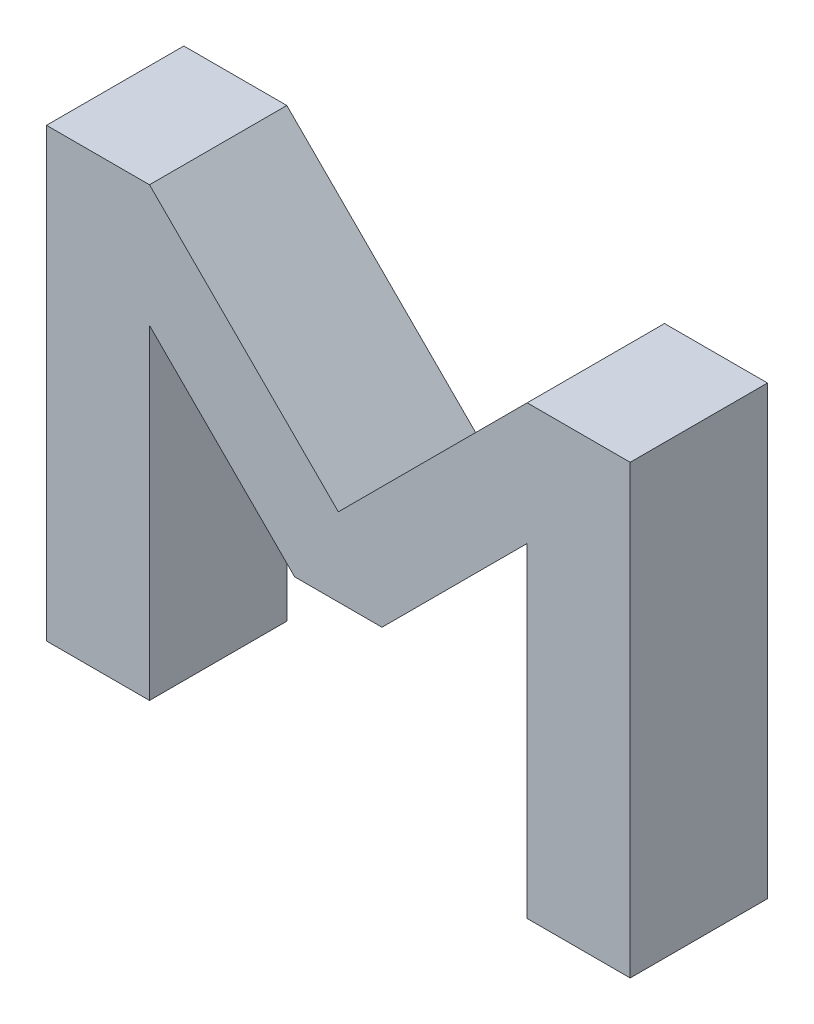
ISO-10303-21;
HEADER;
FILE_DESCRIPTION(('STEP AP214'),'2;1');
FILE_NAME('part.step','',(''),(''),'','','');
FILE_SCHEMA(('AUTOMOTIVE_DESIGN { 1 0 10303 214 1 1 1 1 }'));
ENDSEC;
DATA;
#1=APPLICATION_CONTEXT('core data for automotive mechanical design processes');
#2=APPLICATION_PROTOCOL_DEFINITION('international standard','automotive_design',2000,#1);
#3=PRODUCT_CONTEXT('',#1,'mechanical');
#4=PRODUCT('Part','Part','',(#3));
#5=PRODUCT_RELATED_PRODUCT_CATEGORY('part','',(#4));
#6=PRODUCT_DEFINITION_FORMATION('','',#4);
#7=PRODUCT_DEFINITION_CONTEXT('part definition',#1,'design');
#8=PRODUCT_DEFINITION('design','',#6,#7);
#9=PRODUCT_DEFINITION_SHAPE('','',#8);
#10=(LENGTH_UNIT() NAMED_UNIT(*) SI_UNIT(.MILLI.,.METRE.));
#11=(NAMED_UNIT(*) PLANE_ANGLE_UNIT() SI_UNIT($,.RADIAN.));
#12=(NAMED_UNIT(*) SI_UNIT($,.STERADIAN.) SOLID_ANGLE_UNIT());
#13=UNCERTAINTY_MEASURE_WITH_UNIT(LENGTH_MEASURE(1.E-05),#10,'distance_accuracy_value','');
#14=(GEOMETRIC_REPRESENTATION_CONTEXT(3) GLOBAL_UNCERTAINTY_ASSIGNED_CONTEXT((#13)) GLOBAL_UNIT_ASSIGNED_CONTEXT((#10,
#11,#12)) REPRESENTATION_CONTEXT('',''));
#15=CARTESIAN_POINT('',(0.,0.,0.));
#16=DIRECTION('',(0.,0.,1.));
#17=DIRECTION('',(1.,0.,0.));
#18=AXIS2_PLACEMENT_3D('',#15,#16,#17);
#19=CARTESIAN_POINT('',(175.078092115726,133.228481613816,20.));
#20=DIRECTION('',(0.,1.,0.));
#21=DIRECTION('',(0.,0.,1.));
#22=AXIS2_PLACEMENT_3D('',#19,#20,#21);
#23=PLANE('',#22);
#24=DIRECTION('',(1.,0.,0.));
#25=VECTOR('',#24,1.);
#26=CARTESIAN_POINT('',(175.078092115726,133.228481613816,0.));
#27=LINE('',#26,#25);
#28=CARTESIAN_POINT('',(175.078092115726,133.228481613816,0.));
#29=VERTEX_POINT('',#28);
#30=CARTESIAN_POINT('',(190.078092115726,133.228481613816,0.));
#31=VERTEX_POINT('',#30);
#32=EDGE_CURVE('E160',#29,#31,#27,.T.);
#33=ORIENTED_EDGE('',*,*,#32,.F.);
#34=DIRECTION('',(0.,0.,-1.));
#35=VECTOR('',#34,1.);
#36=CARTESIAN_POINT('',(175.078092115726,133.228481613816,20.));
#37=LINE('',#36,#35);
#38=CARTESIAN_POINT('',(175.078092115726,133.228481613816,20.));
#39=VERTEX_POINT('',#38);
#40=EDGE_CURVE('E11',#39,#29,#37,.T.);
#41=ORIENTED_EDGE('',*,*,#40,.F.);
#42=DIRECTION('',(1.,0.,0.));
#43=VECTOR('',#42,1.);
#44=CARTESIAN_POINT('',(175.078092115726,133.228481613816,20.));
#45=LINE('',#44,#43);
#46=CARTESIAN_POINT('',(190.078092115726,133.228481613816,20.));
#47=VERTEX_POINT('',#46);
#48=EDGE_CURVE('E192',#39,#47,#45,.T.);
#49=ORIENTED_EDGE('',*,*,#48,.T.);
#50=DIRECTION('',(0.,0.,-1.));
#51=VECTOR('',#50,1.);
#52=CARTESIAN_POINT('',(190.078092115726,133.228481613816,20.));
#53=LINE('',#52,#51);
#54=EDGE_CURVE('E37',#47,#31,#53,.T.);
#55=ORIENTED_EDGE('',*,*,#54,.T.);
#56=EDGE_LOOP('',(#33,#41,#49,#55));
#57=FACE_BOUND('',#56,.T.);
#58=ADVANCED_FACE('F34',(#57),#23,.T.);
#59=CARTESIAN_POINT('',(175.078092115726,68.1821352510018,20.));
#60=DIRECTION('',(-1.,0.,0.));
#61=DIRECTION('',(0.,0.,1.));
#62=AXIS2_PLACEMENT_3D('',#59,#60,#61);
#63=PLANE('',#62);
#64=DIRECTION('',(0.,1.,0.));
#65=VECTOR('',#64,1.);
#66=CARTESIAN_POINT('',(175.078092115726,68.1821352510018,0.));
#67=LINE('',#66,#65);
#68=CARTESIAN_POINT('',(175.078092115726,68.1821352510018,0.));
#69=VERTEX_POINT('',#68);
#70=EDGE_CURVE('E190',#69,#29,#67,.T.);
#71=ORIENTED_EDGE('',*,*,#70,.F.);
#72=DIRECTION('',(0.,0.,-1.));
#73=VECTOR('',#72,1.);
#74=CARTESIAN_POINT('',(175.078092115726,68.1821352510018,20.));
#75=LINE('',#74,#73);
#76=CARTESIAN_POINT('',(175.078092115726,68.1821352510018,20.));
#77=VERTEX_POINT('',#76);
#78=EDGE_CURVE('E43',#77,#69,#75,.T.);
#79=ORIENTED_EDGE('',*,*,#78,.F.);
#80=DIRECTION('',(0.,1.,0.));
#81=VECTOR('',#80,1.);
#82=CARTESIAN_POINT('',(175.078092115726,68.1821352510018,20.));
#83=LINE('',#82,#81);
#84=EDGE_CURVE('E140',#77,#39,#83,.T.);
#85=ORIENTED_EDGE('',*,*,#84,.T.);
#86=ORIENTED_EDGE('',*,*,#40,.T.);
#87=EDGE_LOOP('',(#71,#79,#85,#86));
#88=FACE_BOUND('',#87,.T.);
#89=ADVANCED_FACE('F218',(#88),#63,.T.);
#90=CARTESIAN_POINT('',(175.078092115726,68.1821352510018,20.));
#91=DIRECTION('',(0.,1.,0.));
#92=DIRECTION('',(0.,0.,1.));
#93=AXIS2_PLACEMENT_3D('',#90,#91,#92);
#94=PLANE('',#93);
#95=DIRECTION('',(1.,0.,0.));
#96=VECTOR('',#95,1.);
#97=CARTESIAN_POINT('',(175.078092115726,68.1821352510018,0.));
#98=LINE('',#97,#96);
#99=CARTESIAN_POINT('',(190.078092115726,68.1821352510018,0.));
#100=VERTEX_POINT('',#99);
#101=EDGE_CURVE('E145',#69,#100,#98,.T.);
#102=ORIENTED_EDGE('',*,*,#101,.T.);
#103=DIRECTION('',(0.,0.,-1.));
#104=VECTOR('',#103,1.);
#105=CARTESIAN_POINT('',(190.078092115726,68.1821352510018,20.));
#106=LINE('',#105,#104);
#107=CARTESIAN_POINT('',(190.078092115726,68.1821352510018,20.));
#108=VERTEX_POINT('',#107);
#109=EDGE_CURVE('E143',#108,#100,#106,.T.);
#110=ORIENTED_EDGE('',*,*,#109,.F.);
#111=DIRECTION('',(1.,0.,0.));
#112=VECTOR('',#111,1.);
#113=CARTESIAN_POINT('',(175.078092115726,68.1821352510018,20.));
#114=LINE('',#113,#112);
#115=EDGE_CURVE('E134',#77,#108,#114,.T.);
#116=ORIENTED_EDGE('',*,*,#115,.F.);
#117=ORIENTED_EDGE('',*,*,#78,.T.);
#118=EDGE_LOOP('',(#102,#110,#116,#117));
#119=FACE_BOUND('',#118,.T.);
#120=ADVANCED_FACE('F144',(#119),#94,.F.);
#121=CARTESIAN_POINT('',(190.078092115726,68.1821352510018,20.));
#122=DIRECTION('',(-1.,0.,0.));
#123=DIRECTION('',(0.,0.,1.));
#124=AXIS2_PLACEMENT_3D('',#121,#122,#123);
#125=PLANE('',#124);
#126=DIRECTION('',(0.,1.,0.));
#127=VECTOR('',#126,1.);
#128=CARTESIAN_POINT('',(190.078092115726,68.1821352510018,0.));
#129=LINE('',#128,#127);
#130=CARTESIAN_POINT('',(190.078092115726,115.488568969412,0.));
#131=VERTEX_POINT('',#130);
#132=EDGE_CURVE('E187',#100,#131,#129,.T.);
#133=ORIENTED_EDGE('',*,*,#132,.T.);
#134=DIRECTION('',(0.,0.,-1.));
#135=VECTOR('',#134,1.);
#136=CARTESIAN_POINT('',(190.078092115726,115.488568969412,20.));
#137=LINE('',#136,#135);
#138=CARTESIAN_POINT('',(190.078092115726,115.488568969412,20.));
#139=VERTEX_POINT('',#138);
#140=EDGE_CURVE('E148',#139,#131,#137,.T.);
#141=ORIENTED_EDGE('',*,*,#140,.F.);
#142=DIRECTION('',(0.,1.,0.));
#143=VECTOR('',#142,1.);
#144=CARTESIAN_POINT('',(190.078092115726,68.1821352510018,20.));
#145=LINE('',#144,#143);
#146=EDGE_CURVE('E138',#108,#139,#145,.T.);
#147=ORIENTED_EDGE('',*,*,#146,.F.);
#148=ORIENTED_EDGE('',*,*,#109,.T.);
#149=EDGE_LOOP('',(#133,#141,#147,#148));
#150=FACE_BOUND('',#149,.T.);
#151=ADVANCED_FACE('F150',(#150),#125,.F.);
#152=CARTESIAN_POINT('',(190.078092115726,115.488568969412,20.));
#153=DIRECTION('',(0.707106781186541,0.707106781186554,0.));
#154=DIRECTION('',(-0.707106781186554,0.707106781186541,0.));
#155=AXIS2_PLACEMENT_3D('',#152,#153,#154);
#156=PLANE('',#155);
#157=DIRECTION('',(0.707106781186554,-0.707106781186541,0.));
#158=VECTOR('',#157,1.);
#159=CARTESIAN_POINT('',(190.078092115726,115.488568969412,0.));
#160=LINE('',#159,#158);
#161=CARTESIAN_POINT('',(211.22065940617,94.3460016789684,0.));
#162=VERTEX_POINT('',#161);
#163=EDGE_CURVE('E185',#131,#162,#160,.T.);
#164=ORIENTED_EDGE('',*,*,#163,.T.);
#165=DIRECTION('',(0.,0.,-1.));
#166=VECTOR('',#165,1.);
#167=CARTESIAN_POINT('',(211.22065940617,94.3460016789684,20.));
#168=LINE('',#167,#166);
#169=CARTESIAN_POINT('',(211.22065940617,94.3460016789684,20.));
#170=VERTEX_POINT('',#169);
#171=EDGE_CURVE('E196',#170,#162,#168,.T.);
#172=ORIENTED_EDGE('',*,*,#171,.F.);
#173=DIRECTION('',(0.707106781186554,-0.707106781186541,0.));
#174=VECTOR('',#173,1.);
#175=CARTESIAN_POINT('',(190.078092115726,115.488568969412,20.));
#176=LINE('',#175,#174);
#177=EDGE_CURVE('E153',#139,#170,#176,.T.);
#178=ORIENTED_EDGE('',*,*,#177,.F.);
#179=ORIENTED_EDGE('',*,*,#140,.T.);
#180=EDGE_LOOP('',(#164,#172,#178,#179));
#181=FACE_BOUND('',#180,.T.);
#182=ADVANCED_FACE('F231',(#181),#156,.F.);
#183=CARTESIAN_POINT('',(211.22065940617,94.3460016789684,20.));
#184=DIRECTION('',(0.,1.,0.));
#185=DIRECTION('',(0.,0.,1.));
#186=AXIS2_PLACEMENT_3D('',#183,#184,#185);
#187=PLANE('',#186);
#188=DIRECTION('',(1.,0.,0.));
#189=VECTOR('',#188,1.);
#190=CARTESIAN_POINT('',(211.22065940617,94.3460016789684,0.));
#191=LINE('',#190,#189);
#192=CARTESIAN_POINT('',(223.939272913051,94.3460016789684,0.));
#193=VERTEX_POINT('',#192);
#194=EDGE_CURVE('E182',#162,#193,#191,.T.);
#195=ORIENTED_EDGE('',*,*,#194,.T.);
#196=DIRECTION('',(0.,0.,-1.));
#197=VECTOR('',#196,1.);
#198=CARTESIAN_POINT('',(223.939272913051,94.3460016789684,20.));
#199=LINE('',#198,#197);
#200=CARTESIAN_POINT('',(223.939272913051,94.3460016789684,20.));
#201=VERTEX_POINT('',#200);
#202=EDGE_CURVE('E199',#201,#193,#199,.T.);
#203=ORIENTED_EDGE('',*,*,#202,.F.);
#204=DIRECTION('',(1.,0.,0.));
#205=VECTOR('',#204,1.);
#206=CARTESIAN_POINT('',(211.22065940617,94.3460016789684,20.));
#207=LINE('',#206,#205);
#208=EDGE_CURVE('E155',#170,#201,#207,.T.);
#209=ORIENTED_EDGE('',*,*,#208,.F.);
#210=ORIENTED_EDGE('',*,*,#171,.T.);
#211=EDGE_LOOP('',(#195,#203,#209,#210));
#212=FACE_BOUND('',#211,.T.);
#213=ADVANCED_FACE('F234',(#212),#187,.F.);
#214=CARTESIAN_POINT('',(245.081840203495,115.488568969412,20.));
#215=DIRECTION('',(0.707106781186541,-0.707106781186554,0.));
#216=DIRECTION('',(0.707106781186554,0.707106781186541,0.));
#217=AXIS2_PLACEMENT_3D('',#214,#215,#216);
#218=PLANE('',#217);
#219=DIRECTION('',(-0.707106781186554,-0.707106781186541,0.));
#220=VECTOR('',#219,1.);
#221=CARTESIAN_POINT('',(245.081840203495,115.488568969412,0.));
#222=LINE('',#221,#220);
#223=CARTESIAN_POINT('',(245.081840203495,115.488568969412,0.));
#224=VERTEX_POINT('',#223);
#225=EDGE_CURVE('E179',#224,#193,#222,.T.);
#226=ORIENTED_EDGE('',*,*,#225,.F.);
#227=DIRECTION('',(0.,0.,-1.));
#228=VECTOR('',#227,1.);
#229=CARTESIAN_POINT('',(245.081840203495,115.488568969412,20.));
#230=LINE('',#229,#228);
#231=CARTESIAN_POINT('',(245.081840203495,115.488568969412,20.));
#232=VERTEX_POINT('',#231);
#233=EDGE_CURVE('E201',#232,#224,#230,.T.);
#234=ORIENTED_EDGE('',*,*,#233,.F.);
#235=DIRECTION('',(-0.707106781186554,-0.707106781186541,0.));
#236=VECTOR('',#235,1.);
#237=CARTESIAN_POINT('',(245.081840203495,115.488568969412,20.));
#238=LINE('',#237,#236);
#239=EDGE_CURVE('E393',#232,#201,#238,.T.);
#240=ORIENTED_EDGE('',*,*,#239,.T.);
#241=ORIENTED_EDGE('',*,*,#202,.T.);
#242=EDGE_LOOP('',(#226,#234,#240,#241));
#243=FACE_BOUND('',#242,.T.);
#244=ADVANCED_FACE('F238',(#243),#218,.T.);
#245=CARTESIAN_POINT('',(245.081840203495,68.1821352510018,20.));
#246=DIRECTION('',(-1.,0.,0.));
#247=DIRECTION('',(0.,0.,1.));
#248=AXIS2_PLACEMENT_3D('',#245,#246,#247);
#249=PLANE('',#248);
#250=DIRECTION('',(0.,1.,0.));
#251=VECTOR('',#250,1.);
#252=CARTESIAN_POINT('',(245.081840203495,68.1821352510018,0.));
#253=LINE('',#252,#251);
#254=CARTESIAN_POINT('',(245.081840203495,68.1821352510018,0.));
#255=VERTEX_POINT('',#254);
#256=EDGE_CURVE('E176',#255,#224,#253,.T.);
#257=ORIENTED_EDGE('',*,*,#256,.F.);
#258=DIRECTION('',(0.,0.,-1.));
#259=VECTOR('',#258,1.);
#260=CARTESIAN_POINT('',(245.081840203495,68.1821352510018,20.));
#261=LINE('',#260,#259);
#262=CARTESIAN_POINT('',(245.081840203495,68.1821352510018,20.));
#263=VERTEX_POINT('',#262);
#264=EDGE_CURVE('E203',#263,#255,#261,.T.);
#265=ORIENTED_EDGE('',*,*,#264,.F.);
#266=DIRECTION('',(0.,1.,0.));
#267=VECTOR('',#266,1.);
#268=CARTESIAN_POINT('',(245.081840203495,68.1821352510018,20.));
#269=LINE('',#268,#267);
#270=EDGE_CURVE('E389',#263,#232,#269,.T.);
#271=ORIENTED_EDGE('',*,*,#270,.T.);
#272=ORIENTED_EDGE('',*,*,#233,.T.);
#273=EDGE_LOOP('',(#257,#265,#271,#272));
#274=FACE_BOUND('',#273,.T.);
#275=ADVANCED_FACE('F242',(#274),#249,.T.);
#276=CARTESIAN_POINT('',(260.081840203495,68.1821352510018,20.));
#277=DIRECTION('',(0.,-1.,0.));
#278=DIRECTION('',(0.,0.,-1.));
#279=AXIS2_PLACEMENT_3D('',#276,#277,#278);
#280=PLANE('',#279);
#281=DIRECTION('',(-1.,0.,0.));
#282=VECTOR('',#281,1.);
#283=CARTESIAN_POINT('',(260.081840203495,68.1821352510018,0.));
#284=LINE('',#283,#282);
#285=CARTESIAN_POINT('',(260.081840203495,68.1821352510018,0.));
#286=VERTEX_POINT('',#285);
#287=EDGE_CURVE('E173',#286,#255,#284,.T.);
#288=ORIENTED_EDGE('',*,*,#287,.F.);
#289=DIRECTION('',(0.,0.,-1.));
#290=VECTOR('',#289,1.);
#291=CARTESIAN_POINT('',(260.081840203495,68.1821352510018,20.));
#292=LINE('',#291,#290);
#293=CARTESIAN_POINT('',(260.081840203495,68.1821352510018,20.));
#294=VERTEX_POINT('',#293);
#295=EDGE_CURVE('E205',#294,#286,#292,.T.);
#296=ORIENTED_EDGE('',*,*,#295,.F.);
#297=DIRECTION('',(-1.,0.,0.));
#298=VECTOR('',#297,1.);
#299=CARTESIAN_POINT('',(260.081840203495,68.1821352510018,20.));
#300=LINE('',#299,#298);
#301=EDGE_CURVE('E383',#294,#263,#300,.T.);
#302=ORIENTED_EDGE('',*,*,#301,.T.);
#303=ORIENTED_EDGE('',*,*,#264,.T.);
#304=EDGE_LOOP('',(#288,#296,#302,#303));
#305=FACE_BOUND('',#304,.T.);
#306=ADVANCED_FACE('F246',(#305),#280,.T.);
#307=CARTESIAN_POINT('',(260.081840203495,68.1821352510018,20.));
#308=DIRECTION('',(-1.,0.,0.));
#309=DIRECTION('',(0.,0.,1.));
#310=AXIS2_PLACEMENT_3D('',#307,#308,#309);
#311=PLANE('',#310);
#312=DIRECTION('',(0.,1.,0.));
#313=VECTOR('',#312,1.);
#314=CARTESIAN_POINT('',(260.081840203495,68.1821352510018,0.));
#315=LINE('',#314,#313);
#316=CARTESIAN_POINT('',(260.081840203495,133.228481613816,0.));
#317=VERTEX_POINT('',#316);
#318=EDGE_CURVE('E171',#286,#317,#315,.T.);
#319=ORIENTED_EDGE('',*,*,#318,.T.);
#320=DIRECTION('',(0.,0.,-1.));
#321=VECTOR('',#320,1.);
#322=CARTESIAN_POINT('',(260.081840203495,133.228481613816,20.));
#323=LINE('',#322,#321);
#324=CARTESIAN_POINT('',(260.081840203495,133.228481613816,20.));
#325=VERTEX_POINT('',#324);
#326=EDGE_CURVE('E207',#325,#317,#323,.T.);
#327=ORIENTED_EDGE('',*,*,#326,.F.);
#328=DIRECTION('',(0.,1.,0.));
#329=VECTOR('',#328,1.);
#330=CARTESIAN_POINT('',(260.081840203495,68.1821352510018,20.));
#331=LINE('',#330,#329);
#332=EDGE_CURVE('E380',#294,#325,#331,.T.);
#333=ORIENTED_EDGE('',*,*,#332,.F.);
#334=ORIENTED_EDGE('',*,*,#295,.T.);
#335=EDGE_LOOP('',(#319,#327,#333,#334));
#336=FACE_BOUND('',#335,.T.);
#337=ADVANCED_FACE('F250',(#336),#311,.F.);
#338=CARTESIAN_POINT('',(260.081840203495,133.228481613816,20.));
#339=DIRECTION('',(0.,-1.,0.));
#340=DIRECTION('',(0.,0.,-1.));
#341=AXIS2_PLACEMENT_3D('',#338,#339,#340);
#342=PLANE('',#341);
#343=DIRECTION('',(-1.,0.,0.));
#344=VECTOR('',#343,1.);
#345=CARTESIAN_POINT('',(260.081840203495,133.228481613816,0.));
#346=LINE('',#345,#344);
#347=CARTESIAN_POINT('',(245.081840203495,133.228481613816,0.));
#348=VERTEX_POINT('',#347);
#349=EDGE_CURVE('E169',#317,#348,#346,.T.);
#350=ORIENTED_EDGE('',*,*,#349,.T.);
#351=DIRECTION('',(0.,0.,-1.));
#352=VECTOR('',#351,1.);
#353=CARTESIAN_POINT('',(245.081840203495,133.228481613816,20.));
#354=LINE('',#353,#352);
#355=CARTESIAN_POINT('',(245.081840203495,133.228481613816,20.));
#356=VERTEX_POINT('',#355);
#357=EDGE_CURVE('E210',#356,#348,#354,.T.);
#358=ORIENTED_EDGE('',*,*,#357,.F.);
#359=DIRECTION('',(-1.,0.,0.));
#360=VECTOR('',#359,1.);
#361=CARTESIAN_POINT('',(260.081840203495,133.228481613816,20.));
#362=LINE('',#361,#360);
#363=EDGE_CURVE('E378',#325,#356,#362,.T.);
#364=ORIENTED_EDGE('',*,*,#363,.F.);
#365=ORIENTED_EDGE('',*,*,#326,.T.);
#366=EDGE_LOOP('',(#350,#358,#364,#365));
#367=FACE_BOUND('',#366,.T.);
#368=ADVANCED_FACE('F254',(#367),#342,.F.);
#369=CARTESIAN_POINT('',(245.081840203495,133.228481613816,20.));
#370=DIRECTION('',(0.707106781186539,-0.707106781186556,0.));
#371=DIRECTION('',(0.707106781186556,0.707106781186539,0.));
#372=AXIS2_PLACEMENT_3D('',#369,#370,#371);
#373=PLANE('',#372);
#374=DIRECTION('',(-0.707106781186556,-0.707106781186539,0.));
#375=VECTOR('',#374,1.);
#376=CARTESIAN_POINT('',(245.081840203495,133.228481613816,0.));
#377=LINE('',#376,#375);
#378=CARTESIAN_POINT('',(217.579966159611,105.726607569932,0.));
#379=VERTEX_POINT('',#378);
#380=EDGE_CURVE('E166',#348,#379,#377,.T.);
#381=ORIENTED_EDGE('',*,*,#380,.T.);
#382=DIRECTION('',(0.,0.,-1.));
#383=VECTOR('',#382,1.);
#384=CARTESIAN_POINT('',(217.579966159611,105.726607569932,20.));
#385=LINE('',#384,#383);
#386=CARTESIAN_POINT('',(217.579966159611,105.726607569932,20.));
#387=VERTEX_POINT('',#386);
#388=EDGE_CURVE('E212',#387,#379,#385,.T.);
#389=ORIENTED_EDGE('',*,*,#388,.F.);
#390=DIRECTION('',(-0.707106781186556,-0.707106781186539,0.));
#391=VECTOR('',#390,1.);
#392=CARTESIAN_POINT('',(245.081840203495,133.228481613816,20.));
#393=LINE('',#392,#391);
#394=EDGE_CURVE('E403',#356,#387,#393,.T.);
#395=ORIENTED_EDGE('',*,*,#394,.F.);
#396=ORIENTED_EDGE('',*,*,#357,.T.);
#397=EDGE_LOOP('',(#381,#389,#395,#396));
#398=FACE_BOUND('',#397,.T.);
#399=ADVANCED_FACE('F258',(#398),#373,.F.);
#400=CARTESIAN_POINT('',(190.078092115726,133.228481613816,20.));
#401=DIRECTION('',(0.707106781186539,0.707106781186556,0.));
#402=DIRECTION('',(-0.707106781186556,0.707106781186539,0.));
#403=AXIS2_PLACEMENT_3D('',#400,#401,#402);
#404=PLANE('',#403);
#405=DIRECTION('',(0.707106781186556,-0.707106781186539,0.));
#406=VECTOR('',#405,1.);
#407=CARTESIAN_POINT('',(190.078092115726,133.228481613816,0.));
#408=LINE('',#407,#406);
#409=EDGE_CURVE('E163',#31,#379,#408,.T.);
#410=ORIENTED_EDGE('',*,*,#409,.F.);
#411=ORIENTED_EDGE('',*,*,#54,.F.);
#412=DIRECTION('',(0.707106781186556,-0.707106781186539,0.));
#413=VECTOR('',#412,1.);
#414=CARTESIAN_POINT('',(190.078092115726,133.228481613816,20.));
#415=LINE('',#414,#413);
#416=EDGE_CURVE('E405',#47,#387,#415,.T.);
#417=ORIENTED_EDGE('',*,*,#416,.T.);
#418=ORIENTED_EDGE('',*,*,#388,.T.);
#419=EDGE_LOOP('',(#410,#411,#417,#418));
#420=FACE_BOUND('',#419,.T.);
#421=ADVANCED_FACE('F214',(#420),#404,.T.);
#422=CARTESIAN_POINT('',(0.,0.,20.));
#423=DIRECTION('',(0.,0.,1.));
#424=DIRECTION('',(1.,0.,0.));
#425=AXIS2_PLACEMENT_3D('',#422,#423,#424);
#426=PLANE('',#425);
#427=ORIENTED_EDGE('',*,*,#48,.F.);
#428=ORIENTED_EDGE('',*,*,#84,.F.);
#429=ORIENTED_EDGE('',*,*,#115,.T.);
#430=ORIENTED_EDGE('',*,*,#146,.T.);
#431=ORIENTED_EDGE('',*,*,#177,.T.);
#432=ORIENTED_EDGE('',*,*,#208,.T.);
#433=ORIENTED_EDGE('',*,*,#239,.F.);
#434=ORIENTED_EDGE('',*,*,#270,.F.);
#435=ORIENTED_EDGE('',*,*,#301,.F.);
#436=ORIENTED_EDGE('',*,*,#332,.T.);
#437=ORIENTED_EDGE('',*,*,#363,.T.);
#438=ORIENTED_EDGE('',*,*,#394,.T.);
#439=ORIENTED_EDGE('',*,*,#416,.F.);
#440=EDGE_LOOP('',(#427,#428,#429,#430,#431,#432,#433,#434,#435,#436,#437,#438,#439));
#441=FACE_BOUND('',#440,.T.);
#442=ADVANCED_FACE('F136',(#441),#426,.T.);
#443=CARTESIAN_POINT('',(0.,0.,0.));
#444=DIRECTION('',(0.,0.,1.));
#445=DIRECTION('',(1.,0.,0.));
#446=AXIS2_PLACEMENT_3D('',#443,#444,#445);
#447=PLANE('',#446);
#448=ORIENTED_EDGE('',*,*,#32,.T.);
#449=ORIENTED_EDGE('',*,*,#409,.T.);
#450=ORIENTED_EDGE('',*,*,#380,.F.);
#451=ORIENTED_EDGE('',*,*,#349,.F.);
#452=ORIENTED_EDGE('',*,*,#318,.F.);
#453=ORIENTED_EDGE('',*,*,#287,.T.);
#454=ORIENTED_EDGE('',*,*,#256,.T.);
#455=ORIENTED_EDGE('',*,*,#225,.T.);
#456=ORIENTED_EDGE('',*,*,#194,.F.);
#457=ORIENTED_EDGE('',*,*,#163,.F.);
#458=ORIENTED_EDGE('',*,*,#132,.F.);
#459=ORIENTED_EDGE('',*,*,#101,.F.);
#460=ORIENTED_EDGE('',*,*,#70,.T.);
#461=EDGE_LOOP('',(#448,#449,#450,#451,#452,#453,#454,#455,#456,#457,#458,#459,#460));
#462=FACE_BOUND('',#461,.T.);
#463=ADVANCED_FACE('F217',(#462),#447,.F.);
#464=CLOSED_SHELL('',(#58,#89,#120,#151,#182,#213,#244,#275,#306,#337,#368,#399,#421,#442,#463));
#465=MANIFOLD_SOLID_BREP('B2',#464);
#466=ADVANCED_BREP_SHAPE_REPRESENTATION('',(#18,#465),#14);
#467=SHAPE_DEFINITION_REPRESENTATION(#9,#466);
ENDSEC;
END-ISO-10303-21;
